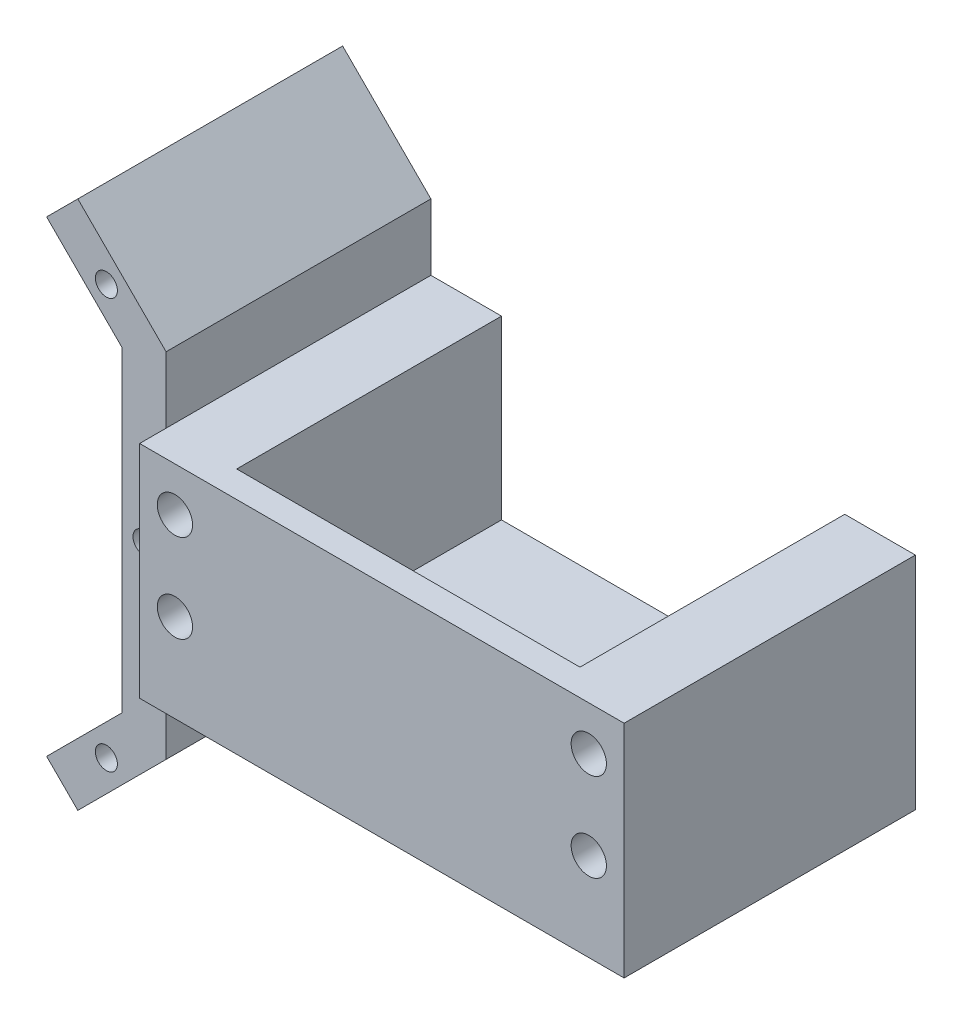
ISO-10303-21;
HEADER;
FILE_DESCRIPTION(('STEP AP214'),'2;1');
FILE_NAME('part.step','',(''),(''),'','','');
FILE_SCHEMA(('AUTOMOTIVE_DESIGN { 1 0 10303 214 1 1 1 1 }'));
ENDSEC;
DATA;
#1=APPLICATION_CONTEXT('core data for automotive mechanical design processes');
#2=APPLICATION_PROTOCOL_DEFINITION('international standard','automotive_design',2000,#1);
#3=PRODUCT_CONTEXT('',#1,'mechanical');
#4=PRODUCT('Part','Part','',(#3));
#5=PRODUCT_RELATED_PRODUCT_CATEGORY('part','',(#4));
#6=PRODUCT_DEFINITION_FORMATION('','',#4);
#7=PRODUCT_DEFINITION_CONTEXT('part definition',#1,'design');
#8=PRODUCT_DEFINITION('design','',#6,#7);
#9=PRODUCT_DEFINITION_SHAPE('','',#8);
#10=(LENGTH_UNIT() NAMED_UNIT(*) SI_UNIT(.MILLI.,.METRE.));
#11=(NAMED_UNIT(*) PLANE_ANGLE_UNIT() SI_UNIT($,.RADIAN.));
#12=(NAMED_UNIT(*) SI_UNIT($,.STERADIAN.) SOLID_ANGLE_UNIT());
#13=UNCERTAINTY_MEASURE_WITH_UNIT(LENGTH_MEASURE(1.E-05),#10,'distance_accuracy_value','');
#14=(GEOMETRIC_REPRESENTATION_CONTEXT(3) GLOBAL_UNCERTAINTY_ASSIGNED_CONTEXT((#13)) GLOBAL_UNIT_ASSIGNED_CONTEXT((#10,
#11,#12)) REPRESENTATION_CONTEXT('',''));
#15=CARTESIAN_POINT('',(0.,0.,0.));
#16=DIRECTION('',(0.,0.,1.));
#17=DIRECTION('',(1.,0.,0.));
#18=AXIS2_PLACEMENT_3D('',#15,#16,#17);
#19=CARTESIAN_POINT('',(76.5428942736656,28.7092869812751,33.));
#20=DIRECTION('',(-1.,0.,0.));
#21=DIRECTION('',(0.,0.,1.));
#22=AXIS2_PLACEMENT_3D('',#19,#20,#21);
#23=PLANE('',#22);
#24=DIRECTION('',(0.,0.,-1.));
#25=VECTOR('',#24,1.);
#26=CARTESIAN_POINT('',(76.5428942736656,28.7092869812751,33.));
#27=LINE('',#26,#25);
#28=CARTESIAN_POINT('',(76.5428942736656,28.7092869812751,30.));
#29=VERTEX_POINT('',#28);
#30=CARTESIAN_POINT('',(76.5428942736656,28.7092869812751,0.));
#31=VERTEX_POINT('',#30);
#32=EDGE_CURVE('E216',#29,#31,#27,.T.);
#33=ORIENTED_EDGE('',*,*,#32,.F.);
#34=DIRECTION('',(0.,1.,0.));
#35=VECTOR('',#34,1.);
#36=CARTESIAN_POINT('',(76.5428942736656,48.7092869812751,30.));
#37=LINE('',#36,#35);
#38=CARTESIAN_POINT('',(76.5428942736656,48.7092869812751,30.));
#39=VERTEX_POINT('',#38);
#40=EDGE_CURVE('E54',#29,#39,#37,.T.);
#41=ORIENTED_EDGE('',*,*,#40,.T.);
#42=DIRECTION('',(0.,0.,-1.));
#43=VECTOR('',#42,1.);
#44=CARTESIAN_POINT('',(76.5428942736656,48.7092869812751,33.));
#45=LINE('',#44,#43);
#46=CARTESIAN_POINT('',(76.5428942736656,48.7092869812751,0.));
#47=VERTEX_POINT('',#46);
#48=EDGE_CURVE('E214',#39,#47,#45,.T.);
#49=ORIENTED_EDGE('',*,*,#48,.T.);
#50=DIRECTION('',(0.,1.,0.));
#51=VECTOR('',#50,1.);
#52=CARTESIAN_POINT('',(76.5428942736656,28.7092869812751,0.));
#53=LINE('',#52,#51);
#54=EDGE_CURVE('E202',#31,#47,#53,.T.);
#55=ORIENTED_EDGE('',*,*,#54,.F.);
#56=EDGE_LOOP('',(#33,#41,#49,#55));
#57=FACE_BOUND('',#56,.T.);
#58=ADVANCED_FACE('F36',(#57),#23,.T.);
#59=CARTESIAN_POINT('',(37.65294386587,28.7092869812752,33.));
#60=DIRECTION('',(0.,1.,0.));
#61=DIRECTION('',(-1.,0.,0.));
#62=AXIS2_PLACEMENT_3D('',#59,#60,#61);
#63=PLANE('',#62);
#64=DIRECTION('',(0.,0.,-1.));
#65=VECTOR('',#64,1.);
#66=CARTESIAN_POINT('',(37.65294386587,28.7092869812752,33.));
#67=LINE('',#66,#65);
#68=CARTESIAN_POINT('',(37.65294386587,28.7092869812752,30.));
#69=VERTEX_POINT('',#68);
#70=CARTESIAN_POINT('',(37.65294386587,28.7092869812752,0.));
#71=VERTEX_POINT('',#70);
#72=EDGE_CURVE('E218',#69,#71,#67,.T.);
#73=ORIENTED_EDGE('',*,*,#72,.F.);
#74=DIRECTION('',(1.,0.,0.));
#75=VECTOR('',#74,1.);
#76=CARTESIAN_POINT('',(37.65294386587,28.7092869812751,30.));
#77=LINE('',#76,#75);
#78=EDGE_CURVE('E62',#69,#29,#77,.T.);
#79=ORIENTED_EDGE('',*,*,#78,.T.);
#80=ORIENTED_EDGE('',*,*,#32,.T.);
#81=DIRECTION('',(1.,0.,0.));
#82=VECTOR('',#81,1.);
#83=CARTESIAN_POINT('',(37.65294386587,28.7092869812752,0.));
#84=LINE('',#83,#82);
#85=EDGE_CURVE('E199',#71,#31,#84,.T.);
#86=ORIENTED_EDGE('',*,*,#85,.F.);
#87=EDGE_LOOP('',(#73,#79,#80,#86));
#88=FACE_BOUND('',#87,.T.);
#89=ADVANCED_FACE('F344',(#88),#63,.T.);
#90=CARTESIAN_POINT('',(37.65294386587,48.7092869812751,33.));
#91=DIRECTION('',(1.,0.,0.));
#92=DIRECTION('',(0.,1.,0.));
#93=AXIS2_PLACEMENT_3D('',#90,#91,#92);
#94=PLANE('',#93);
#95=DIRECTION('',(0.,0.,-1.));
#96=VECTOR('',#95,1.);
#97=CARTESIAN_POINT('',(37.65294386587,48.7092869812751,33.));
#98=LINE('',#97,#96);
#99=CARTESIAN_POINT('',(37.65294386587,48.7092869812751,30.));
#100=VERTEX_POINT('',#99);
#101=CARTESIAN_POINT('',(37.65294386587,48.7092869812751,0.));
#102=VERTEX_POINT('',#101);
#103=EDGE_CURVE('E220',#100,#102,#98,.T.);
#104=ORIENTED_EDGE('',*,*,#103,.F.);
#105=DIRECTION('',(0.,-1.,0.));
#106=VECTOR('',#105,1.);
#107=CARTESIAN_POINT('',(37.65294386587,48.7092869812751,30.));
#108=LINE('',#107,#106);
#109=EDGE_CURVE('E572',#100,#69,#108,.T.);
#110=ORIENTED_EDGE('',*,*,#109,.T.);
#111=ORIENTED_EDGE('',*,*,#72,.T.);
#112=DIRECTION('',(0.,-1.,0.));
#113=VECTOR('',#112,1.);
#114=CARTESIAN_POINT('',(37.65294386587,48.7092869812751,0.));
#115=LINE('',#114,#113);
#116=EDGE_CURVE('E196',#102,#71,#115,.T.);
#117=ORIENTED_EDGE('',*,*,#116,.F.);
#118=EDGE_LOOP('',(#104,#110,#111,#117));
#119=FACE_BOUND('',#118,.T.);
#120=ADVANCED_FACE('F348',(#119),#94,.T.);
#121=CARTESIAN_POINT('',(29.65294386587,16.2092869812751,30.));
#122=DIRECTION('',(-1.,0.,0.));
#123=DIRECTION('',(0.,0.,1.));
#124=AXIS2_PLACEMENT_3D('',#121,#122,#123);
#125=PLANE('',#124);
#126=DIRECTION('',(0.,0.,-1.));
#127=VECTOR('',#126,1.);
#128=CARTESIAN_POINT('',(29.65294386587,23.7092869812752,33.));
#129=LINE('',#128,#127);
#130=CARTESIAN_POINT('',(29.65294386587,23.7092869812752,30.));
#131=VERTEX_POINT('',#130);
#132=CARTESIAN_POINT('',(29.65294386587,23.7092869812752,0.));
#133=VERTEX_POINT('',#132);
#134=EDGE_CURVE('E11',#131,#133,#129,.T.);
#135=ORIENTED_EDGE('',*,*,#134,.F.);
#136=DIRECTION('',(0.,1.,0.));
#137=VECTOR('',#136,1.);
#138=CARTESIAN_POINT('',(29.65294386587,16.2092869812751,30.));
#139=LINE('',#138,#137);
#140=CARTESIAN_POINT('',(29.65294386587,16.2092869812751,30.));
#141=VERTEX_POINT('',#140);
#142=EDGE_CURVE('E246',#141,#131,#139,.T.);
#143=ORIENTED_EDGE('',*,*,#142,.F.);
#144=DIRECTION('',(0.,0.,-1.));
#145=VECTOR('',#144,1.);
#146=CARTESIAN_POINT('',(29.65294386587,16.2092869812751,30.));
#147=LINE('',#146,#145);
#148=CARTESIAN_POINT('',(29.65294386587,16.2092869812751,0.));
#149=VERTEX_POINT('',#148);
#150=EDGE_CURVE('E40',#141,#149,#147,.T.);
#151=ORIENTED_EDGE('',*,*,#150,.T.);
#152=DIRECTION('',(0.,1.,0.));
#153=VECTOR('',#152,1.);
#154=CARTESIAN_POINT('',(29.65294386587,16.2092869812751,0.));
#155=LINE('',#154,#153);
#156=EDGE_CURVE('E265',#149,#133,#155,.T.);
#157=ORIENTED_EDGE('',*,*,#156,.T.);
#158=EDGE_LOOP('',(#135,#143,#151,#157));
#159=FACE_BOUND('',#158,.T.);
#160=ADVANCED_FACE('F328',(#159),#125,.F.);
#161=CARTESIAN_POINT('',(0.,0.,30.));
#162=DIRECTION('',(0.,0.,-1.));
#163=DIRECTION('',(-1.,0.,0.));
#164=AXIS2_PLACEMENT_3D('',#161,#162,#163);
#165=PLANE('',#164);
#166=DIRECTION('',(0.707106781186548,0.707106781186548,0.));
#167=VECTOR('',#166,1.);
#168=CARTESIAN_POINT('',(29.65294386587,16.2092869812751,30.));
#169=LINE('',#168,#167);
#170=CARTESIAN_POINT('',(19.65294386587,6.20928698127511,30.));
#171=VERTEX_POINT('',#170);
#172=EDGE_CURVE('E241',#171,#141,#169,.T.);
#173=ORIENTED_EDGE('',*,*,#172,.T.);
#174=ORIENTED_EDGE('',*,*,#142,.T.);
#175=CARTESIAN_POINT('',(29.65294386587,48.7092869812751,30.));
#176=VERTEX_POINT('',#175);
#177=EDGE_CURVE('E177',#131,#176,#139,.T.);
#178=ORIENTED_EDGE('',*,*,#177,.T.);
#179=CARTESIAN_POINT('',(29.65294386587,56.2092869812751,30.));
#180=VERTEX_POINT('',#179);
#181=EDGE_CURVE('E244',#176,#180,#139,.T.);
#182=ORIENTED_EDGE('',*,*,#181,.T.);
#183=DIRECTION('',(-0.707106781186548,0.707106781186547,0.));
#184=VECTOR('',#183,1.);
#185=CARTESIAN_POINT('',(29.65294386587,56.2092869812751,30.));
#186=LINE('',#185,#184);
#187=CARTESIAN_POINT('',(19.65294386587,66.2092869812751,30.));
#188=VERTEX_POINT('',#187);
#189=EDGE_CURVE('E249',#180,#188,#186,.T.);
#190=ORIENTED_EDGE('',*,*,#189,.T.);
#191=DIRECTION('',(-0.707106781186554,-0.707106781186541,0.));
#192=VECTOR('',#191,1.);
#193=CARTESIAN_POINT('',(19.65294386587,66.2092869812751,30.));
#194=LINE('',#193,#192);
#195=CARTESIAN_POINT('',(16.1174099599373,62.6737530753424,30.));
#196=VERTEX_POINT('',#195);
#197=EDGE_CURVE('E251',#188,#196,#194,.T.);
#198=ORIENTED_EDGE('',*,*,#197,.T.);
#199=DIRECTION('',(0.707106781186547,-0.707106781186548,0.));
#200=VECTOR('',#199,1.);
#201=CARTESIAN_POINT('',(24.65294386587,54.1382191694097,30.));
#202=LINE('',#201,#200);
#203=CARTESIAN_POINT('',(24.65294386587,54.1382191694097,30.));
#204=VERTEX_POINT('',#203);
#205=EDGE_CURVE('E253',#196,#204,#202,.T.);
#206=ORIENTED_EDGE('',*,*,#205,.T.);
#207=DIRECTION('',(0.,-1.,0.));
#208=VECTOR('',#207,1.);
#209=CARTESIAN_POINT('',(24.65294386587,18.2803547931406,30.));
#210=LINE('',#209,#208);
#211=CARTESIAN_POINT('',(24.65294386587,18.2803547931406,30.));
#212=VERTEX_POINT('',#211);
#213=EDGE_CURVE('E255',#204,#212,#210,.T.);
#214=ORIENTED_EDGE('',*,*,#213,.T.);
#215=DIRECTION('',(-0.707106781186548,-0.707106781186547,0.));
#216=VECTOR('',#215,1.);
#217=CARTESIAN_POINT('',(24.65294386587,18.2803547931406,30.));
#218=LINE('',#217,#216);
#219=CARTESIAN_POINT('',(16.1174099599373,9.74482088720784,30.));
#220=VERTEX_POINT('',#219);
#221=EDGE_CURVE('E257',#212,#220,#218,.T.);
#222=ORIENTED_EDGE('',*,*,#221,.T.);
#223=DIRECTION('',(0.707106781186552,-0.707106781186543,0.));
#224=VECTOR('',#223,1.);
#225=CARTESIAN_POINT('',(19.65294386587,6.20928698127511,30.));
#226=LINE('',#225,#224);
#227=EDGE_CURVE('E259',#220,#171,#226,.T.);
#228=ORIENTED_EDGE('',*,*,#227,.T.);
#229=EDGE_LOOP('',(#173,#174,#178,#182,#190,#198,#206,#214,#222,#228));
#230=FACE_BOUND('',#229,.T.);
#231=CARTESIAN_POINT('',(22.8851769129037,12.9770539342415,30.));
#232=DIRECTION('',(0.,0.,1.));
#233=DIRECTION('',(1.,0.,0.));
#234=AXIS2_PLACEMENT_3D('',#231,#232,#233);
#235=CIRCLE('',#234,1.25);
#236=CARTESIAN_POINT('',(24.1351769129037,12.9770539342415,30.));
#237=VERTEX_POINT('',#236);
#238=EDGE_CURVE('E235',#237,#237,#235,.T.);
#239=ORIENTED_EDGE('',*,*,#238,.F.);
#240=EDGE_LOOP('',(#239));
#241=FACE_BOUND('',#240,.T.);
#242=CARTESIAN_POINT('',(27.15294386587,36.2092869812751,30.));
#243=DIRECTION('',(0.,0.,1.));
#244=DIRECTION('',(1.,0.,0.));
#245=AXIS2_PLACEMENT_3D('',#242,#243,#244);
#246=CIRCLE('',#245,1.25);
#247=CARTESIAN_POINT('',(28.40294386587,36.2092869812751,30.));
#248=VERTEX_POINT('',#247);
#249=EDGE_CURVE('E229',#248,#248,#246,.T.);
#250=ORIENTED_EDGE('',*,*,#249,.F.);
#251=EDGE_LOOP('',(#250));
#252=FACE_BOUND('',#251,.T.);
#253=CARTESIAN_POINT('',(22.8851769129037,59.4415200283088,30.));
#254=DIRECTION('',(0.,0.,1.));
#255=DIRECTION('',(1.,0.,0.));
#256=AXIS2_PLACEMENT_3D('',#253,#254,#255);
#257=CIRCLE('',#256,1.25);
#258=CARTESIAN_POINT('',(24.1351769129037,59.4415200283088,30.));
#259=VERTEX_POINT('',#258);
#260=EDGE_CURVE('E223',#259,#259,#257,.T.);
#261=ORIENTED_EDGE('',*,*,#260,.F.);
#262=EDGE_LOOP('',(#261));
#263=FACE_BOUND('',#262,.T.);
#264=ADVANCED_FACE('F324',(#230,#241,#252,#263),#165,.F.);
#265=CARTESIAN_POINT('',(0.,0.,0.));
#266=DIRECTION('',(0.,0.,-1.));
#267=DIRECTION('',(-1.,0.,0.));
#268=AXIS2_PLACEMENT_3D('',#265,#266,#267);
#269=PLANE('',#268);
#270=CARTESIAN_POINT('',(27.15294386587,36.2092869812751,0.));
#271=DIRECTION('',(0.,0.,1.));
#272=DIRECTION('',(1.,0.,0.));
#273=AXIS2_PLACEMENT_3D('',#270,#271,#272);
#274=CIRCLE('',#273,1.25);
#275=CARTESIAN_POINT('',(28.40294386587,36.2092869812751,0.));
#276=VERTEX_POINT('',#275);
#277=EDGE_CURVE('E226',#276,#276,#274,.T.);
#278=ORIENTED_EDGE('',*,*,#277,.T.);
#279=EDGE_LOOP('',(#278));
#280=FACE_BOUND('',#279,.T.);
#281=DIRECTION('',(0.707106781186548,0.707106781186548,0.));
#282=VECTOR('',#281,1.);
#283=CARTESIAN_POINT('',(29.65294386587,16.2092869812751,0.));
#284=LINE('',#283,#282);
#285=CARTESIAN_POINT('',(19.65294386587,6.20928698127511,0.));
#286=VERTEX_POINT('',#285);
#287=EDGE_CURVE('E238',#286,#149,#284,.T.);
#288=ORIENTED_EDGE('',*,*,#287,.F.);
#289=DIRECTION('',(0.707106781186552,-0.707106781186543,0.));
#290=VECTOR('',#289,1.);
#291=CARTESIAN_POINT('',(19.65294386587,6.20928698127511,0.));
#292=LINE('',#291,#290);
#293=CARTESIAN_POINT('',(16.1174099599373,9.74482088720784,0.));
#294=VERTEX_POINT('',#293);
#295=EDGE_CURVE('E245',#294,#286,#292,.T.);
#296=ORIENTED_EDGE('',*,*,#295,.F.);
#297=DIRECTION('',(-0.707106781186548,-0.707106781186547,0.));
#298=VECTOR('',#297,1.);
#299=CARTESIAN_POINT('',(24.65294386587,18.2803547931406,0.));
#300=LINE('',#299,#298);
#301=CARTESIAN_POINT('',(24.65294386587,18.2803547931406,0.));
#302=VERTEX_POINT('',#301);
#303=EDGE_CURVE('E276',#302,#294,#300,.T.);
#304=ORIENTED_EDGE('',*,*,#303,.F.);
#305=DIRECTION('',(0.,-1.,0.));
#306=VECTOR('',#305,1.);
#307=CARTESIAN_POINT('',(24.65294386587,18.2803547931406,0.));
#308=LINE('',#307,#306);
#309=CARTESIAN_POINT('',(24.65294386587,54.1382191694097,0.));
#310=VERTEX_POINT('',#309);
#311=EDGE_CURVE('E274',#310,#302,#308,.T.);
#312=ORIENTED_EDGE('',*,*,#311,.F.);
#313=DIRECTION('',(0.707106781186547,-0.707106781186548,0.));
#314=VECTOR('',#313,1.);
#315=CARTESIAN_POINT('',(24.65294386587,54.1382191694097,0.));
#316=LINE('',#315,#314);
#317=CARTESIAN_POINT('',(16.1174099599373,62.6737530753424,0.));
#318=VERTEX_POINT('',#317);
#319=EDGE_CURVE('E272',#318,#310,#316,.T.);
#320=ORIENTED_EDGE('',*,*,#319,.F.);
#321=DIRECTION('',(-0.707106781186554,-0.707106781186541,0.));
#322=VECTOR('',#321,1.);
#323=CARTESIAN_POINT('',(19.65294386587,66.2092869812751,0.));
#324=LINE('',#323,#322);
#325=CARTESIAN_POINT('',(19.65294386587,66.2092869812751,0.));
#326=VERTEX_POINT('',#325);
#327=EDGE_CURVE('E270',#326,#318,#324,.T.);
#328=ORIENTED_EDGE('',*,*,#327,.F.);
#329=DIRECTION('',(-0.707106781186548,0.707106781186547,0.));
#330=VECTOR('',#329,1.);
#331=CARTESIAN_POINT('',(29.65294386587,56.2092869812751,0.));
#332=LINE('',#331,#330);
#333=CARTESIAN_POINT('',(29.65294386587,56.2092869812751,0.));
#334=VERTEX_POINT('',#333);
#335=EDGE_CURVE('E268',#334,#326,#332,.T.);
#336=ORIENTED_EDGE('',*,*,#335,.F.);
#337=CARTESIAN_POINT('',(29.65294386587,48.7092869812751,0.));
#338=VERTEX_POINT('',#337);
#339=EDGE_CURVE('E264',#338,#334,#155,.T.);
#340=ORIENTED_EDGE('',*,*,#339,.F.);
#341=DIRECTION('',(1.,0.,0.));
#342=VECTOR('',#341,1.);
#343=CARTESIAN_POINT('',(37.65294386587,48.7092869812751,0.));
#344=LINE('',#343,#342);
#345=EDGE_CURVE('E192',#338,#102,#344,.T.);
#346=ORIENTED_EDGE('',*,*,#345,.T.);
#347=ORIENTED_EDGE('',*,*,#116,.T.);
#348=ORIENTED_EDGE('',*,*,#85,.T.);
#349=ORIENTED_EDGE('',*,*,#54,.T.);
#350=DIRECTION('',(1.,0.,0.));
#351=VECTOR('',#350,1.);
#352=CARTESIAN_POINT('',(76.5428942736656,48.7092869812751,0.));
#353=LINE('',#352,#351);
#354=CARTESIAN_POINT('',(84.5428942736656,48.7092869812751,0.));
#355=VERTEX_POINT('',#354);
#356=EDGE_CURVE('E205',#47,#355,#353,.T.);
#357=ORIENTED_EDGE('',*,*,#356,.T.);
#358=DIRECTION('',(0.,-1.,0.));
#359=VECTOR('',#358,1.);
#360=CARTESIAN_POINT('',(84.5428942736656,23.7092869812752,0.));
#361=LINE('',#360,#359);
#362=CARTESIAN_POINT('',(84.5428942736656,23.7092869812752,0.));
#363=VERTEX_POINT('',#362);
#364=EDGE_CURVE('E169',#355,#363,#361,.T.);
#365=ORIENTED_EDGE('',*,*,#364,.T.);
#366=DIRECTION('',(-1.,0.,0.));
#367=VECTOR('',#366,1.);
#368=CARTESIAN_POINT('',(29.65294386587,23.7092869812752,0.));
#369=LINE('',#368,#367);
#370=EDGE_CURVE('E189',#363,#133,#369,.T.);
#371=ORIENTED_EDGE('',*,*,#370,.T.);
#372=ORIENTED_EDGE('',*,*,#156,.F.);
#373=EDGE_LOOP('',(#288,#296,#304,#312,#320,#328,#336,#340,#346,#347,#348,#349,#357,#365,#371,#372));
#374=FACE_BOUND('',#373,.T.);
#375=CARTESIAN_POINT('',(22.8851769129037,12.9770539342415,0.));
#376=DIRECTION('',(0.,0.,1.));
#377=DIRECTION('',(1.,0.,0.));
#378=AXIS2_PLACEMENT_3D('',#375,#376,#377);
#379=CIRCLE('',#378,1.25);
#380=CARTESIAN_POINT('',(24.1351769129037,12.9770539342415,0.));
#381=VERTEX_POINT('',#380);
#382=EDGE_CURVE('E232',#381,#381,#379,.T.);
#383=ORIENTED_EDGE('',*,*,#382,.T.);
#384=EDGE_LOOP('',(#383));
#385=FACE_BOUND('',#384,.T.);
#386=CARTESIAN_POINT('',(22.8851769129037,59.4415200283088,0.));
#387=DIRECTION('',(0.,0.,1.));
#388=DIRECTION('',(1.,0.,0.));
#389=AXIS2_PLACEMENT_3D('',#386,#387,#388);
#390=CIRCLE('',#389,1.25);
#391=CARTESIAN_POINT('',(24.1351769129037,59.4415200283088,0.));
#392=VERTEX_POINT('',#391);
#393=EDGE_CURVE('E211',#392,#392,#390,.T.);
#394=ORIENTED_EDGE('',*,*,#393,.T.);
#395=EDGE_LOOP('',(#394));
#396=FACE_BOUND('',#395,.T.);
#397=CARTESIAN_POINT('',(33.65294386587,43.7092869812751,0.));
#398=DIRECTION('',(0.,0.,-1.));
#399=DIRECTION('',(1.,0.,0.));
#400=AXIS2_PLACEMENT_3D('',#397,#398,#399);
#401=CIRCLE('',#400,2.);
#402=CARTESIAN_POINT('',(35.65294386587,43.7092869812751,0.));
#403=VERTEX_POINT('',#402);
#404=EDGE_CURVE('E577',#403,#403,#401,.T.);
#405=ORIENTED_EDGE('',*,*,#404,.F.);
#406=EDGE_LOOP('',(#405));
#407=FACE_BOUND('',#406,.T.);
#408=CARTESIAN_POINT('',(33.65294386587,33.7092869812751,0.));
#409=DIRECTION('',(0.,0.,-1.));
#410=DIRECTION('',(1.,0.,0.));
#411=AXIS2_PLACEMENT_3D('',#408,#409,#410);
#412=CIRCLE('',#411,2.);
#413=CARTESIAN_POINT('',(35.65294386587,33.7092869812751,0.));
#414=VERTEX_POINT('',#413);
#415=EDGE_CURVE('E586',#414,#414,#412,.T.);
#416=ORIENTED_EDGE('',*,*,#415,.F.);
#417=EDGE_LOOP('',(#416));
#418=FACE_BOUND('',#417,.T.);
#419=CARTESIAN_POINT('',(80.5428942736656,43.7092869812751,0.));
#420=DIRECTION('',(0.,0.,-1.));
#421=DIRECTION('',(-1.,0.,0.));
#422=AXIS2_PLACEMENT_3D('',#419,#420,#421);
#423=CIRCLE('',#422,2.);
#424=CARTESIAN_POINT('',(78.5428942736656,43.7092869812751,0.));
#425=VERTEX_POINT('',#424);
#426=EDGE_CURVE('E591',#425,#425,#423,.T.);
#427=ORIENTED_EDGE('',*,*,#426,.F.);
#428=EDGE_LOOP('',(#427));
#429=FACE_BOUND('',#428,.T.);
#430=CARTESIAN_POINT('',(80.5428942736656,33.7092869812751,0.));
#431=DIRECTION('',(0.,0.,-1.));
#432=DIRECTION('',(-1.,0.,0.));
#433=AXIS2_PLACEMENT_3D('',#430,#431,#432);
#434=CIRCLE('',#433,2.);
#435=CARTESIAN_POINT('',(78.5428942736656,33.7092869812751,0.));
#436=VERTEX_POINT('',#435);
#437=EDGE_CURVE('E597',#436,#436,#434,.T.);
#438=ORIENTED_EDGE('',*,*,#437,.F.);
#439=EDGE_LOOP('',(#438));
#440=FACE_BOUND('',#439,.T.);
#441=ADVANCED_FACE('F312',(#280,#374,#385,#396,#407,#418,#429,#440),#269,.T.);
#442=CARTESIAN_POINT('',(29.65294386587,16.2092869812751,30.));
#443=DIRECTION('',(-0.707106781186547,0.707106781186547,0.));
#444=DIRECTION('',(-0.707106781186548,-0.707106781186548,0.));
#445=AXIS2_PLACEMENT_3D('',#442,#443,#444);
#446=PLANE('',#445);
#447=ORIENTED_EDGE('',*,*,#287,.T.);
#448=ORIENTED_EDGE('',*,*,#150,.F.);
#449=ORIENTED_EDGE('',*,*,#172,.F.);
#450=DIRECTION('',(0.,0.,-1.));
#451=VECTOR('',#450,1.);
#452=CARTESIAN_POINT('',(19.65294386587,6.20928698127511,30.));
#453=LINE('',#452,#451);
#454=EDGE_CURVE('E261',#171,#286,#453,.T.);
#455=ORIENTED_EDGE('',*,*,#454,.T.);
#456=EDGE_LOOP('',(#447,#448,#449,#455));
#457=FACE_BOUND('',#456,.T.);
#458=ADVANCED_FACE('F38',(#457),#446,.F.);
#459=ORIENTED_EDGE('',*,*,#181,.F.);
#460=DIRECTION('',(0.,0.,-1.));
#461=VECTOR('',#460,1.);
#462=CARTESIAN_POINT('',(29.65294386587,48.7092869812751,33.));
#463=LINE('',#462,#461);
#464=EDGE_CURVE('E45',#176,#338,#463,.T.);
#465=ORIENTED_EDGE('',*,*,#464,.T.);
#466=ORIENTED_EDGE('',*,*,#339,.T.);
#467=DIRECTION('',(0.,0.,-1.));
#468=VECTOR('',#467,1.);
#469=CARTESIAN_POINT('',(29.65294386587,56.2092869812751,30.));
#470=LINE('',#469,#468);
#471=EDGE_CURVE('E295',#180,#334,#470,.T.);
#472=ORIENTED_EDGE('',*,*,#471,.F.);
#473=EDGE_LOOP('',(#459,#465,#466,#472));
#474=FACE_BOUND('',#473,.T.);
#475=ADVANCED_FACE('F308',(#474),#125,.F.);
#476=CARTESIAN_POINT('',(29.65294386587,56.2092869812751,30.));
#477=DIRECTION('',(-0.707106781186547,-0.707106781186548,0.));
#478=DIRECTION('',(0.707106781186548,-0.707106781186547,0.));
#479=AXIS2_PLACEMENT_3D('',#476,#477,#478);
#480=PLANE('',#479);
#481=ORIENTED_EDGE('',*,*,#335,.T.);
#482=DIRECTION('',(0.,0.,-1.));
#483=VECTOR('',#482,1.);
#484=CARTESIAN_POINT('',(19.65294386587,66.2092869812751,30.));
#485=LINE('',#484,#483);
#486=EDGE_CURVE('E293',#188,#326,#485,.T.);
#487=ORIENTED_EDGE('',*,*,#486,.F.);
#488=ORIENTED_EDGE('',*,*,#189,.F.);
#489=ORIENTED_EDGE('',*,*,#471,.T.);
#490=EDGE_LOOP('',(#481,#487,#488,#489));
#491=FACE_BOUND('',#490,.T.);
#492=ADVANCED_FACE('F317',(#491),#480,.F.);
#493=CARTESIAN_POINT('',(19.65294386587,66.2092869812751,30.));
#494=DIRECTION('',(0.707106781186541,-0.707106781186554,0.));
#495=DIRECTION('',(0.707106781186554,0.707106781186541,0.));
#496=AXIS2_PLACEMENT_3D('',#493,#494,#495);
#497=PLANE('',#496);
#498=ORIENTED_EDGE('',*,*,#327,.T.);
#499=DIRECTION('',(0.,0.,-1.));
#500=VECTOR('',#499,1.);
#501=CARTESIAN_POINT('',(16.1174099599373,62.6737530753424,30.));
#502=LINE('',#501,#500);
#503=EDGE_CURVE('E290',#196,#318,#502,.T.);
#504=ORIENTED_EDGE('',*,*,#503,.F.);
#505=ORIENTED_EDGE('',*,*,#197,.F.);
#506=ORIENTED_EDGE('',*,*,#486,.T.);
#507=EDGE_LOOP('',(#498,#504,#505,#506));
#508=FACE_BOUND('',#507,.T.);
#509=ADVANCED_FACE('F320',(#508),#497,.F.);
#510=CARTESIAN_POINT('',(24.65294386587,54.1382191694097,30.));
#511=DIRECTION('',(0.707106781186548,0.707106781186547,0.));
#512=DIRECTION('',(-0.707106781186547,0.707106781186548,0.));
#513=AXIS2_PLACEMENT_3D('',#510,#511,#512);
#514=PLANE('',#513);
#515=ORIENTED_EDGE('',*,*,#319,.T.);
#516=DIRECTION('',(0.,0.,-1.));
#517=VECTOR('',#516,1.);
#518=CARTESIAN_POINT('',(24.65294386587,54.1382191694097,30.));
#519=LINE('',#518,#517);
#520=EDGE_CURVE('E287',#204,#310,#519,.T.);
#521=ORIENTED_EDGE('',*,*,#520,.F.);
#522=ORIENTED_EDGE('',*,*,#205,.F.);
#523=ORIENTED_EDGE('',*,*,#503,.T.);
#524=EDGE_LOOP('',(#515,#521,#522,#523));
#525=FACE_BOUND('',#524,.T.);
#526=ADVANCED_FACE('F384',(#525),#514,.F.);
#527=CARTESIAN_POINT('',(24.65294386587,18.2803547931406,30.));
#528=DIRECTION('',(1.,0.,0.));
#529=DIRECTION('',(0.,0.,-1.));
#530=AXIS2_PLACEMENT_3D('',#527,#528,#529);
#531=PLANE('',#530);
#532=ORIENTED_EDGE('',*,*,#311,.T.);
#533=DIRECTION('',(0.,0.,-1.));
#534=VECTOR('',#533,1.);
#535=CARTESIAN_POINT('',(24.65294386587,18.2803547931406,30.));
#536=LINE('',#535,#534);
#537=EDGE_CURVE('E284',#212,#302,#536,.T.);
#538=ORIENTED_EDGE('',*,*,#537,.F.);
#539=ORIENTED_EDGE('',*,*,#213,.F.);
#540=ORIENTED_EDGE('',*,*,#520,.T.);
#541=EDGE_LOOP('',(#532,#538,#539,#540));
#542=FACE_BOUND('',#541,.T.);
#543=ADVANCED_FACE('F380',(#542),#531,.F.);
#544=CARTESIAN_POINT('',(24.65294386587,18.2803547931406,30.));
#545=DIRECTION('',(0.707106781186547,-0.707106781186548,0.));
#546=DIRECTION('',(0.707106781186548,0.707106781186547,0.));
#547=AXIS2_PLACEMENT_3D('',#544,#545,#546);
#548=PLANE('',#547);
#549=ORIENTED_EDGE('',*,*,#303,.T.);
#550=DIRECTION('',(0.,0.,-1.));
#551=VECTOR('',#550,1.);
#552=CARTESIAN_POINT('',(16.1174099599373,9.74482088720784,30.));
#553=LINE('',#552,#551);
#554=EDGE_CURVE('E281',#220,#294,#553,.T.);
#555=ORIENTED_EDGE('',*,*,#554,.F.);
#556=ORIENTED_EDGE('',*,*,#221,.F.);
#557=ORIENTED_EDGE('',*,*,#537,.T.);
#558=EDGE_LOOP('',(#549,#555,#556,#557));
#559=FACE_BOUND('',#558,.T.);
#560=ADVANCED_FACE('F376',(#559),#548,.F.);
#561=CARTESIAN_POINT('',(19.65294386587,6.20928698127511,30.));
#562=DIRECTION('',(0.707106781186543,0.707106781186552,0.));
#563=DIRECTION('',(-0.707106781186552,0.707106781186543,0.));
#564=AXIS2_PLACEMENT_3D('',#561,#562,#563);
#565=PLANE('',#564);
#566=ORIENTED_EDGE('',*,*,#295,.T.);
#567=ORIENTED_EDGE('',*,*,#454,.F.);
#568=ORIENTED_EDGE('',*,*,#227,.F.);
#569=ORIENTED_EDGE('',*,*,#554,.T.);
#570=EDGE_LOOP('',(#566,#567,#568,#569));
#571=FACE_BOUND('',#570,.T.);
#572=ADVANCED_FACE('F367',(#571),#565,.F.);
#573=CARTESIAN_POINT('',(22.8851769129037,12.9770539342415,30.));
#574=DIRECTION('',(0.,0.,-1.));
#575=DIRECTION('',(-1.,0.,0.));
#576=AXIS2_PLACEMENT_3D('',#573,#574,#575);
#577=CYLINDRICAL_SURFACE('',#576,1.25);
#578=ORIENTED_EDGE('',*,*,#238,.T.);
#579=EDGE_LOOP('',(#578));
#580=FACE_BOUND('',#579,.T.);
#581=ORIENTED_EDGE('',*,*,#382,.F.);
#582=EDGE_LOOP('',(#581));
#583=FACE_BOUND('',#582,.T.);
#584=ADVANCED_FACE('F363',(#580,#583),#577,.F.);
#585=CARTESIAN_POINT('',(27.15294386587,36.2092869812751,30.));
#586=DIRECTION('',(0.,0.,-1.));
#587=DIRECTION('',(-1.,0.,0.));
#588=AXIS2_PLACEMENT_3D('',#585,#586,#587);
#589=CYLINDRICAL_SURFACE('',#588,1.25);
#590=ORIENTED_EDGE('',*,*,#249,.T.);
#591=EDGE_LOOP('',(#590));
#592=FACE_BOUND('',#591,.T.);
#593=ORIENTED_EDGE('',*,*,#277,.F.);
#594=EDGE_LOOP('',(#593));
#595=FACE_BOUND('',#594,.T.);
#596=ADVANCED_FACE('F359',(#592,#595),#589,.F.);
#597=CARTESIAN_POINT('',(22.8851769129037,59.4415200283088,30.));
#598=DIRECTION('',(0.,0.,-1.));
#599=DIRECTION('',(-1.,0.,0.));
#600=AXIS2_PLACEMENT_3D('',#597,#598,#599);
#601=CYLINDRICAL_SURFACE('',#600,1.25);
#602=ORIENTED_EDGE('',*,*,#260,.T.);
#603=EDGE_LOOP('',(#602));
#604=FACE_BOUND('',#603,.T.);
#605=ORIENTED_EDGE('',*,*,#393,.F.);
#606=EDGE_LOOP('',(#605));
#607=FACE_BOUND('',#606,.T.);
#608=ADVANCED_FACE('F355',(#604,#607),#601,.F.);
#609=CARTESIAN_POINT('',(29.65294386587,48.7092869812751,33.));
#610=DIRECTION('',(-1.,0.,0.));
#611=DIRECTION('',(0.,-1.,0.));
#612=AXIS2_PLACEMENT_3D('',#609,#610,#611);
#613=PLANE('',#612);
#614=ORIENTED_EDGE('',*,*,#177,.F.);
#615=CARTESIAN_POINT('',(29.65294386587,23.7092869812752,33.));
#616=VERTEX_POINT('',#615);
#617=EDGE_CURVE('E47',#616,#131,#129,.T.);
#618=ORIENTED_EDGE('',*,*,#617,.F.);
#619=DIRECTION('',(0.,1.,0.));
#620=VECTOR('',#619,1.);
#621=CARTESIAN_POINT('',(29.65294386587,28.7092869812752,33.));
#622=LINE('',#621,#620);
#623=CARTESIAN_POINT('',(29.65294386587,48.7092869812751,33.));
#624=VERTEX_POINT('',#623);
#625=EDGE_CURVE('E168',#616,#624,#622,.T.);
#626=ORIENTED_EDGE('',*,*,#625,.T.);
#627=EDGE_CURVE('E178',#624,#176,#463,.T.);
#628=ORIENTED_EDGE('',*,*,#627,.T.);
#629=EDGE_LOOP('',(#614,#618,#626,#628));
#630=FACE_BOUND('',#629,.T.);
#631=ADVANCED_FACE('F173',(#630),#613,.T.);
#632=CARTESIAN_POINT('',(84.5428942736656,23.7092869812752,33.));
#633=DIRECTION('',(1.,0.,0.));
#634=DIRECTION('',(0.,0.,-1.));
#635=AXIS2_PLACEMENT_3D('',#632,#633,#634);
#636=PLANE('',#635);
#637=ORIENTED_EDGE('',*,*,#364,.F.);
#638=DIRECTION('',(0.,0.,-1.));
#639=VECTOR('',#638,1.);
#640=CARTESIAN_POINT('',(84.5428942736656,48.7092869812751,33.));
#641=LINE('',#640,#639);
#642=CARTESIAN_POINT('',(84.5428942736656,48.7092869812751,33.));
#643=VERTEX_POINT('',#642);
#644=EDGE_CURVE('E212',#643,#355,#641,.T.);
#645=ORIENTED_EDGE('',*,*,#644,.F.);
#646=DIRECTION('',(0.,-1.,0.));
#647=VECTOR('',#646,1.);
#648=CARTESIAN_POINT('',(84.5428942736656,23.7092869812752,33.));
#649=LINE('',#648,#647);
#650=CARTESIAN_POINT('',(84.5428942736656,23.7092869812752,33.));
#651=VERTEX_POINT('',#650);
#652=EDGE_CURVE('E179',#643,#651,#649,.T.);
#653=ORIENTED_EDGE('',*,*,#652,.T.);
#654=DIRECTION('',(0.,0.,-1.));
#655=VECTOR('',#654,1.);
#656=CARTESIAN_POINT('',(84.5428942736656,23.7092869812752,33.));
#657=LINE('',#656,#655);
#658=EDGE_CURVE('E163',#651,#363,#657,.T.);
#659=ORIENTED_EDGE('',*,*,#658,.T.);
#660=EDGE_LOOP('',(#637,#645,#653,#659));
#661=FACE_BOUND('',#660,.T.);
#662=ADVANCED_FACE('F332',(#661),#636,.T.);
#663=CARTESIAN_POINT('',(76.5428942736656,48.7092869812751,33.));
#664=DIRECTION('',(0.,1.,0.));
#665=DIRECTION('',(0.,0.,1.));
#666=AXIS2_PLACEMENT_3D('',#663,#664,#665);
#667=PLANE('',#666);
#668=ORIENTED_EDGE('',*,*,#356,.F.);
#669=ORIENTED_EDGE('',*,*,#48,.F.);
#670=DIRECTION('',(-1.,0.,0.));
#671=VECTOR('',#670,1.);
#672=CARTESIAN_POINT('',(37.65294386587,48.7092869812751,30.));
#673=LINE('',#672,#671);
#674=EDGE_CURVE('E574',#39,#100,#673,.T.);
#675=ORIENTED_EDGE('',*,*,#674,.T.);
#676=ORIENTED_EDGE('',*,*,#103,.T.);
#677=ORIENTED_EDGE('',*,*,#345,.F.);
#678=ORIENTED_EDGE('',*,*,#464,.F.);
#679=ORIENTED_EDGE('',*,*,#627,.F.);
#680=DIRECTION('',(1.,0.,0.));
#681=VECTOR('',#680,1.);
#682=CARTESIAN_POINT('',(76.5428942736656,48.7092869812751,33.));
#683=LINE('',#682,#681);
#684=EDGE_CURVE('E183',#624,#643,#683,.T.);
#685=ORIENTED_EDGE('',*,*,#684,.T.);
#686=ORIENTED_EDGE('',*,*,#644,.T.);
#687=EDGE_LOOP('',(#668,#669,#675,#676,#677,#678,#679,#685,#686));
#688=FACE_BOUND('',#687,.T.);
#689=ADVANCED_FACE('F333',(#688),#667,.T.);
#690=CARTESIAN_POINT('',(29.65294386587,23.7092869812752,33.));
#691=DIRECTION('',(0.,-1.,0.));
#692=DIRECTION('',(0.,0.,-1.));
#693=AXIS2_PLACEMENT_3D('',#690,#691,#692);
#694=PLANE('',#693);
#695=ORIENTED_EDGE('',*,*,#370,.F.);
#696=ORIENTED_EDGE('',*,*,#658,.F.);
#697=DIRECTION('',(-1.,0.,0.));
#698=VECTOR('',#697,1.);
#699=CARTESIAN_POINT('',(76.5428942736656,23.7092869812752,33.));
#700=LINE('',#699,#698);
#701=EDGE_CURVE('E158',#651,#616,#700,.T.);
#702=ORIENTED_EDGE('',*,*,#701,.T.);
#703=ORIENTED_EDGE('',*,*,#617,.T.);
#704=ORIENTED_EDGE('',*,*,#134,.T.);
#705=EDGE_LOOP('',(#695,#696,#702,#703,#704));
#706=FACE_BOUND('',#705,.T.);
#707=ADVANCED_FACE('F160',(#706),#694,.T.);
#708=CARTESIAN_POINT('',(0.,0.,33.));
#709=DIRECTION('',(0.,0.,1.));
#710=DIRECTION('',(1.,0.,0.));
#711=AXIS2_PLACEMENT_3D('',#708,#709,#710);
#712=PLANE('',#711);
#713=ORIENTED_EDGE('',*,*,#684,.F.);
#714=ORIENTED_EDGE('',*,*,#625,.F.);
#715=ORIENTED_EDGE('',*,*,#701,.F.);
#716=ORIENTED_EDGE('',*,*,#652,.F.);
#717=EDGE_LOOP('',(#713,#714,#715,#716));
#718=FACE_BOUND('',#717,.T.);
#719=CARTESIAN_POINT('',(33.65294386587,43.7092869812751,33.));
#720=DIRECTION('',(0.,0.,-1.));
#721=DIRECTION('',(1.,0.,0.));
#722=AXIS2_PLACEMENT_3D('',#719,#720,#721);
#723=CIRCLE('',#722,2.);
#724=CARTESIAN_POINT('',(35.65294386587,43.7092869812751,33.));
#725=VERTEX_POINT('',#724);
#726=EDGE_CURVE('E580',#725,#725,#723,.T.);
#727=ORIENTED_EDGE('',*,*,#726,.T.);
#728=EDGE_LOOP('',(#727));
#729=FACE_BOUND('',#728,.T.);
#730=CARTESIAN_POINT('',(33.65294386587,33.7092869812751,33.));
#731=DIRECTION('',(0.,0.,-1.));
#732=DIRECTION('',(1.,0.,0.));
#733=AXIS2_PLACEMENT_3D('',#730,#731,#732);
#734=CIRCLE('',#733,2.);
#735=CARTESIAN_POINT('',(35.65294386587,33.7092869812751,33.));
#736=VERTEX_POINT('',#735);
#737=EDGE_CURVE('E588',#736,#736,#734,.T.);
#738=ORIENTED_EDGE('',*,*,#737,.T.);
#739=EDGE_LOOP('',(#738));
#740=FACE_BOUND('',#739,.T.);
#741=CARTESIAN_POINT('',(80.5428942736656,43.7092869812751,33.));
#742=DIRECTION('',(0.,0.,-1.));
#743=DIRECTION('',(-1.,0.,0.));
#744=AXIS2_PLACEMENT_3D('',#741,#742,#743);
#745=CIRCLE('',#744,2.);
#746=CARTESIAN_POINT('',(78.5428942736656,43.7092869812751,33.));
#747=VERTEX_POINT('',#746);
#748=EDGE_CURVE('E594',#747,#747,#745,.T.);
#749=ORIENTED_EDGE('',*,*,#748,.T.);
#750=EDGE_LOOP('',(#749));
#751=FACE_BOUND('',#750,.T.);
#752=CARTESIAN_POINT('',(80.5428942736656,33.7092869812751,33.));
#753=DIRECTION('',(0.,0.,-1.));
#754=DIRECTION('',(-1.,0.,0.));
#755=AXIS2_PLACEMENT_3D('',#752,#753,#754);
#756=CIRCLE('',#755,2.);
#757=CARTESIAN_POINT('',(78.5428942736656,33.7092869812751,33.));
#758=VERTEX_POINT('',#757);
#759=EDGE_CURVE('E193',#758,#758,#756,.T.);
#760=ORIENTED_EDGE('',*,*,#759,.T.);
#761=EDGE_LOOP('',(#760));
#762=FACE_BOUND('',#761,.T.);
#763=ADVANCED_FACE('F180',(#718,#729,#740,#751,#762),#712,.T.);
#764=CARTESIAN_POINT('',(80.5428942736656,33.7092869812751,33.));
#765=DIRECTION('',(0.,0.,-1.));
#766=DIRECTION('',(-1.,0.,0.));
#767=AXIS2_PLACEMENT_3D('',#764,#765,#766);
#768=CYLINDRICAL_SURFACE('',#767,2.);
#769=ORIENTED_EDGE('',*,*,#759,.F.);
#770=EDGE_LOOP('',(#769));
#771=FACE_BOUND('',#770,.T.);
#772=ORIENTED_EDGE('',*,*,#437,.T.);
#773=EDGE_LOOP('',(#772));
#774=FACE_BOUND('',#773,.T.);
#775=ADVANCED_FACE('F495',(#771,#774),#768,.F.);
#776=CARTESIAN_POINT('',(80.5428942736656,43.7092869812751,33.));
#777=DIRECTION('',(0.,0.,-1.));
#778=DIRECTION('',(-1.,0.,0.));
#779=AXIS2_PLACEMENT_3D('',#776,#777,#778);
#780=CYLINDRICAL_SURFACE('',#779,2.);
#781=ORIENTED_EDGE('',*,*,#748,.F.);
#782=EDGE_LOOP('',(#781));
#783=FACE_BOUND('',#782,.T.);
#784=ORIENTED_EDGE('',*,*,#426,.T.);
#785=EDGE_LOOP('',(#784));
#786=FACE_BOUND('',#785,.T.);
#787=ADVANCED_FACE('F500',(#783,#786),#780,.F.);
#788=CARTESIAN_POINT('',(33.65294386587,33.7092869812751,33.));
#789=DIRECTION('',(0.,0.,-1.));
#790=DIRECTION('',(-1.,0.,0.));
#791=AXIS2_PLACEMENT_3D('',#788,#789,#790);
#792=CYLINDRICAL_SURFACE('',#791,2.);
#793=ORIENTED_EDGE('',*,*,#737,.F.);
#794=EDGE_LOOP('',(#793));
#795=FACE_BOUND('',#794,.T.);
#796=ORIENTED_EDGE('',*,*,#415,.T.);
#797=EDGE_LOOP('',(#796));
#798=FACE_BOUND('',#797,.T.);
#799=ADVANCED_FACE('F510',(#795,#798),#792,.F.);
#800=CARTESIAN_POINT('',(33.65294386587,43.7092869812751,33.));
#801=DIRECTION('',(0.,0.,-1.));
#802=DIRECTION('',(-1.,0.,0.));
#803=AXIS2_PLACEMENT_3D('',#800,#801,#802);
#804=CYLINDRICAL_SURFACE('',#803,2.);
#805=ORIENTED_EDGE('',*,*,#726,.F.);
#806=EDGE_LOOP('',(#805));
#807=FACE_BOUND('',#806,.T.);
#808=ORIENTED_EDGE('',*,*,#404,.T.);
#809=EDGE_LOOP('',(#808));
#810=FACE_BOUND('',#809,.T.);
#811=ADVANCED_FACE('F520',(#807,#810),#804,.F.);
#812=CARTESIAN_POINT('',(0.,0.,30.));
#813=DIRECTION('',(0.,0.,1.));
#814=DIRECTION('',(1.,0.,0.));
#815=AXIS2_PLACEMENT_3D('',#812,#813,#814);
#816=PLANE('',#815);
#817=ORIENTED_EDGE('',*,*,#109,.F.);
#818=ORIENTED_EDGE('',*,*,#674,.F.);
#819=ORIENTED_EDGE('',*,*,#40,.F.);
#820=ORIENTED_EDGE('',*,*,#78,.F.);
#821=EDGE_LOOP('',(#817,#818,#819,#820));
#822=FACE_BOUND('',#821,.T.);
#823=ADVANCED_FACE('F529',(#822),#816,.F.);
#824=CLOSED_SHELL('',(#58,#89,#120,#160,#264,#441,#458,#475,#492,#509,#526,#543,#560,#572,#584,
#596,#608,#631,#662,#689,#707,#763,#775,#787,#799,#811,#823));
#825=MANIFOLD_SOLID_BREP('B2',#824);
#826=ADVANCED_BREP_SHAPE_REPRESENTATION('',(#18,#825),#14);
#827=SHAPE_DEFINITION_REPRESENTATION(#9,#826);
ENDSEC;
END-ISO-10303-21;
